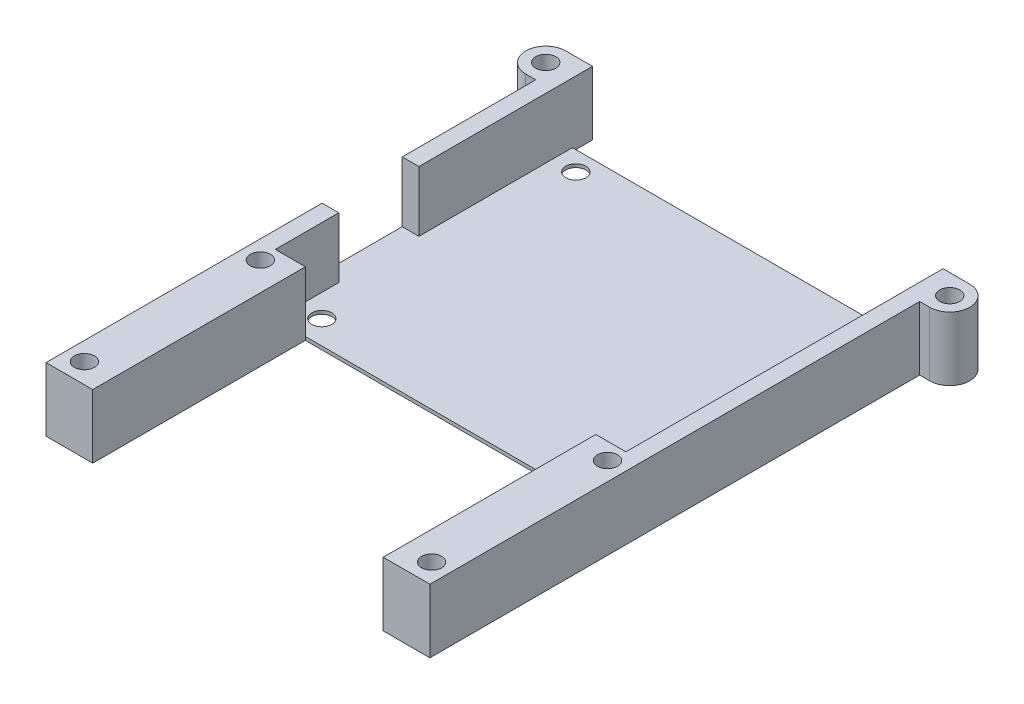
ISO-10303-21;
HEADER;
FILE_DESCRIPTION(('STEP AP214'),'2;1');
FILE_NAME('part.step','',(''),(''),'','','');
FILE_SCHEMA(('AUTOMOTIVE_DESIGN { 1 0 10303 214 1 1 1 1 }'));
ENDSEC;
DATA;
#1=APPLICATION_CONTEXT('core data for automotive mechanical design processes');
#2=APPLICATION_PROTOCOL_DEFINITION('international standard','automotive_design',2000,#1);
#3=PRODUCT_CONTEXT('',#1,'mechanical');
#4=PRODUCT('Part','Part','',(#3));
#5=PRODUCT_RELATED_PRODUCT_CATEGORY('part','',(#4));
#6=PRODUCT_DEFINITION_FORMATION('','',#4);
#7=PRODUCT_DEFINITION_CONTEXT('part definition',#1,'design');
#8=PRODUCT_DEFINITION('design','',#6,#7);
#9=PRODUCT_DEFINITION_SHAPE('','',#8);
#10=(LENGTH_UNIT() NAMED_UNIT(*) SI_UNIT(.MILLI.,.METRE.));
#11=(NAMED_UNIT(*) PLANE_ANGLE_UNIT() SI_UNIT($,.RADIAN.));
#12=(NAMED_UNIT(*) SI_UNIT($,.STERADIAN.) SOLID_ANGLE_UNIT());
#13=UNCERTAINTY_MEASURE_WITH_UNIT(LENGTH_MEASURE(1.E-05),#10,'distance_accuracy_value','');
#14=(GEOMETRIC_REPRESENTATION_CONTEXT(3) GLOBAL_UNCERTAINTY_ASSIGNED_CONTEXT((#13)) GLOBAL_UNIT_ASSIGNED_CONTEXT((#10,
#11,#12)) REPRESENTATION_CONTEXT('',''));
#15=CARTESIAN_POINT('',(0.,0.,0.));
#16=DIRECTION('',(0.,0.,1.));
#17=DIRECTION('',(1.,0.,0.));
#18=AXIS2_PLACEMENT_3D('',#15,#16,#17);
#19=CARTESIAN_POINT('',(0.,0.5,-31.85));
#20=DIRECTION('',(0.,0.,1.));
#21=DIRECTION('',(1.,0.,0.));
#22=AXIS2_PLACEMENT_3D('',#19,#20,#21);
#23=PLANE('',#22);
#24=DIRECTION('',(0.,-1.,0.));
#25=VECTOR('',#24,1.);
#26=CARTESIAN_POINT('',(21.75,9.55,-31.85));
#27=LINE('',#26,#25);
#28=CARTESIAN_POINT('',(21.75,0.5,-31.85));
#29=VERTEX_POINT('',#28);
#30=CARTESIAN_POINT('',(21.75,0.,-31.85));
#31=VERTEX_POINT('',#30);
#32=EDGE_CURVE('E296',#29,#31,#27,.T.);
#33=ORIENTED_EDGE('',*,*,#32,.F.);
#34=DIRECTION('',(-1.,0.,0.));
#35=VECTOR('',#34,1.);
#36=CARTESIAN_POINT('',(0.,0.5,-31.85));
#37=LINE('',#36,#35);
#38=CARTESIAN_POINT('',(-21.75,0.5,-31.85));
#39=VERTEX_POINT('',#38);
#40=EDGE_CURVE('E64',#29,#39,#37,.T.);
#41=ORIENTED_EDGE('',*,*,#40,.T.);
#42=DIRECTION('',(0.,-1.,0.));
#43=VECTOR('',#42,1.);
#44=CARTESIAN_POINT('',(-21.75,9.55,-31.85));
#45=LINE('',#44,#43);
#46=CARTESIAN_POINT('',(-21.75,0.,-31.85));
#47=VERTEX_POINT('',#46);
#48=EDGE_CURVE('E341',#39,#47,#45,.T.);
#49=ORIENTED_EDGE('',*,*,#48,.T.);
#50=DIRECTION('',(-1.,0.,0.));
#51=VECTOR('',#50,1.);
#52=CARTESIAN_POINT('',(0.,0.,-31.85));
#53=LINE('',#52,#51);
#54=EDGE_CURVE('E356',#31,#47,#53,.T.);
#55=ORIENTED_EDGE('',*,*,#54,.F.);
#56=EDGE_LOOP('',(#33,#41,#49,#55));
#57=FACE_BOUND('',#56,.T.);
#58=ADVANCED_FACE('F40',(#57),#23,.T.);
#59=CARTESIAN_POINT('',(0.,0.5,-76.35));
#60=DIRECTION('',(0.,0.,-1.));
#61=DIRECTION('',(-1.,0.,0.));
#62=AXIS2_PLACEMENT_3D('',#59,#60,#61);
#63=PLANE('',#62);
#64=DIRECTION('',(1.,0.,0.));
#65=VECTOR('',#64,1.);
#66=CARTESIAN_POINT('',(0.,0.,-76.35));
#67=LINE('',#66,#65);
#68=CARTESIAN_POINT('',(-26.25,0.,-76.35));
#69=VERTEX_POINT('',#68);
#70=CARTESIAN_POINT('',(26.25,0.,-76.35));
#71=VERTEX_POINT('',#70);
#72=EDGE_CURVE('E376',#69,#71,#67,.T.);
#73=ORIENTED_EDGE('',*,*,#72,.F.);
#74=DIRECTION('',(0.,-1.,0.));
#75=VECTOR('',#74,1.);
#76=CARTESIAN_POINT('',(-26.25,0.5,-76.35));
#77=LINE('',#76,#75);
#78=CARTESIAN_POINT('',(-26.25,0.5,-76.35));
#79=VERTEX_POINT('',#78);
#80=EDGE_CURVE('E48',#79,#69,#77,.T.);
#81=ORIENTED_EDGE('',*,*,#80,.F.);
#82=DIRECTION('',(1.,0.,0.));
#83=VECTOR('',#82,1.);
#84=CARTESIAN_POINT('',(0.,0.5,-76.35));
#85=LINE('',#84,#83);
#86=CARTESIAN_POINT('',(26.25,0.5,-76.35));
#87=VERTEX_POINT('',#86);
#88=EDGE_CURVE('E361',#79,#87,#85,.T.);
#89=ORIENTED_EDGE('',*,*,#88,.T.);
#90=DIRECTION('',(0.,-1.,0.));
#91=VECTOR('',#90,1.);
#92=CARTESIAN_POINT('',(26.25,0.5,-76.35));
#93=LINE('',#92,#91);
#94=EDGE_CURVE('E11',#87,#71,#93,.T.);
#95=ORIENTED_EDGE('',*,*,#94,.T.);
#96=EDGE_LOOP('',(#73,#81,#89,#95));
#97=FACE_BOUND('',#96,.T.);
#98=ADVANCED_FACE('F471',(#97),#63,.T.);
#99=CARTESIAN_POINT('',(-28.75,0.5,0.));
#100=DIRECTION('',(-1.,0.,0.));
#101=DIRECTION('',(0.,0.,1.));
#102=AXIS2_PLACEMENT_3D('',#99,#100,#101);
#103=PLANE('',#102);
#104=DIRECTION('',(0.,0.,-1.));
#105=VECTOR('',#104,1.);
#106=CARTESIAN_POINT('',(-28.75,0.,0.));
#107=LINE('',#106,#105);
#108=CARTESIAN_POINT('',(-28.75,0.,0.));
#109=VERTEX_POINT('',#108);
#110=CARTESIAN_POINT('',(-28.75,0.,-73.35));
#111=VERTEX_POINT('',#110);
#112=EDGE_CURVE('E379',#109,#111,#107,.T.);
#113=ORIENTED_EDGE('',*,*,#112,.F.);
#114=DIRECTION('',(0.,-1.,0.));
#115=VECTOR('',#114,1.);
#116=CARTESIAN_POINT('',(-28.75,9.55,0.));
#117=LINE('',#116,#115);
#118=CARTESIAN_POINT('',(-28.75,9.55,0.));
#119=VERTEX_POINT('',#118);
#120=EDGE_CURVE('E347',#119,#109,#117,.T.);
#121=ORIENTED_EDGE('',*,*,#120,.F.);
#122=DIRECTION('',(0.,0.,-1.));
#123=VECTOR('',#122,1.);
#124=CARTESIAN_POINT('',(-28.75,9.55,0.));
#125=LINE('',#124,#123);
#126=CARTESIAN_POINT('',(-28.75,9.55,-41.35));
#127=VERTEX_POINT('',#126);
#128=EDGE_CURVE('E315',#119,#127,#125,.T.);
#129=ORIENTED_EDGE('',*,*,#128,.T.);
#130=DIRECTION('',(0.,-1.,0.));
#131=VECTOR('',#130,1.);
#132=CARTESIAN_POINT('',(-28.75,9.55,-41.35));
#133=LINE('',#132,#131);
#134=CARTESIAN_POINT('',(-28.75,0.5,-41.35));
#135=VERTEX_POINT('',#134);
#136=EDGE_CURVE('E350',#127,#135,#133,.T.);
#137=ORIENTED_EDGE('',*,*,#136,.T.);
#138=DIRECTION('',(0.,0.,-1.));
#139=VECTOR('',#138,1.);
#140=CARTESIAN_POINT('',(-28.75,0.5,0.));
#141=LINE('',#140,#139);
#142=CARTESIAN_POINT('',(-28.75,0.5,-53.35));
#143=VERTEX_POINT('',#142);
#144=EDGE_CURVE('E370',#135,#143,#141,.T.);
#145=ORIENTED_EDGE('',*,*,#144,.T.);
#146=DIRECTION('',(0.,-1.,0.));
#147=VECTOR('',#146,1.);
#148=CARTESIAN_POINT('',(-28.75,9.55,-53.35));
#149=LINE('',#148,#147);
#150=CARTESIAN_POINT('',(-28.75,9.55,-53.35));
#151=VERTEX_POINT('',#150);
#152=EDGE_CURVE('E248',#151,#143,#149,.T.);
#153=ORIENTED_EDGE('',*,*,#152,.F.);
#154=DIRECTION('',(0.,0.,-1.));
#155=VECTOR('',#154,1.);
#156=CARTESIAN_POINT('',(-28.75,9.55,0.));
#157=LINE('',#156,#155);
#158=CARTESIAN_POINT('',(-28.75,9.55,-73.35));
#159=VERTEX_POINT('',#158);
#160=EDGE_CURVE('E225',#151,#159,#157,.T.);
#161=ORIENTED_EDGE('',*,*,#160,.T.);
#162=DIRECTION('',(0.,-1.,0.));
#163=VECTOR('',#162,1.);
#164=CARTESIAN_POINT('',(-28.75,9.55,-73.35));
#165=LINE('',#164,#163);
#166=EDGE_CURVE('E251',#159,#111,#165,.T.);
#167=ORIENTED_EDGE('',*,*,#166,.T.);
#168=EDGE_LOOP('',(#113,#121,#129,#137,#145,#153,#161,#167));
#169=FACE_BOUND('',#168,.T.);
#170=ADVANCED_FACE('F485',(#169),#103,.T.);
#171=CARTESIAN_POINT('',(0.,0.5,0.));
#172=DIRECTION('',(0.,1.,0.));
#173=DIRECTION('',(0.,0.,1.));
#174=AXIS2_PLACEMENT_3D('',#171,#172,#173);
#175=PLANE('',#174);
#176=CARTESIAN_POINT('',(22.85,0.5,-73.45));
#177=DIRECTION('',(0.,1.,0.));
#178=DIRECTION('',(0.,0.,1.));
#179=AXIS2_PLACEMENT_3D('',#176,#177,#178);
#180=CIRCLE('',#179,1.5);
#181=CARTESIAN_POINT('',(22.85,0.5,-71.95));
#182=VERTEX_POINT('',#181);
#183=EDGE_CURVE('E436',#182,#182,#180,.T.);
#184=ORIENTED_EDGE('',*,*,#183,.F.);
#185=EDGE_LOOP('',(#184));
#186=FACE_BOUND('',#185,.T.);
#187=CARTESIAN_POINT('',(-22.85,0.5,-73.45));
#188=DIRECTION('',(0.,1.,0.));
#189=DIRECTION('',(0.,0.,1.));
#190=AXIS2_PLACEMENT_3D('',#187,#188,#189);
#191=CIRCLE('',#190,1.5);
#192=CARTESIAN_POINT('',(-22.85,0.5,-71.95));
#193=VERTEX_POINT('',#192);
#194=EDGE_CURVE('E430',#193,#193,#191,.T.);
#195=ORIENTED_EDGE('',*,*,#194,.F.);
#196=EDGE_LOOP('',(#195));
#197=FACE_BOUND('',#196,.T.);
#198=CARTESIAN_POINT('',(-22.85,0.5,-35.4));
#199=DIRECTION('',(0.,1.,0.));
#200=DIRECTION('',(0.,0.,1.));
#201=AXIS2_PLACEMENT_3D('',#198,#199,#200);
#202=CIRCLE('',#201,1.5);
#203=CARTESIAN_POINT('',(-22.85,0.5,-33.9));
#204=VERTEX_POINT('',#203);
#205=EDGE_CURVE('E418',#204,#204,#202,.T.);
#206=ORIENTED_EDGE('',*,*,#205,.F.);
#207=EDGE_LOOP('',(#206));
#208=FACE_BOUND('',#207,.T.);
#209=CARTESIAN_POINT('',(22.85,0.5,-35.4));
#210=DIRECTION('',(0.,1.,0.));
#211=DIRECTION('',(0.,0.,1.));
#212=AXIS2_PLACEMENT_3D('',#209,#210,#211);
#213=CIRCLE('',#212,1.5);
#214=CARTESIAN_POINT('',(22.85,0.5,-33.9));
#215=VERTEX_POINT('',#214);
#216=EDGE_CURVE('E412',#215,#215,#213,.T.);
#217=ORIENTED_EDGE('',*,*,#216,.F.);
#218=EDGE_LOOP('',(#217));
#219=FACE_BOUND('',#218,.T.);
#220=CARTESIAN_POINT('',(26.25,0.5,-31.85));
#221=VERTEX_POINT('',#220);
#222=EDGE_CURVE('E357',#221,#29,#37,.T.);
#223=ORIENTED_EDGE('',*,*,#222,.F.);
#224=DIRECTION('',(0.,0.,1.));
#225=VECTOR('',#224,1.);
#226=CARTESIAN_POINT('',(26.25,0.5,0.));
#227=LINE('',#226,#225);
#228=EDGE_CURVE('E359',#87,#221,#227,.T.);
#229=ORIENTED_EDGE('',*,*,#228,.F.);
#230=ORIENTED_EDGE('',*,*,#88,.F.);
#231=DIRECTION('',(0.,0.,1.));
#232=VECTOR('',#231,1.);
#233=CARTESIAN_POINT('',(-26.25,0.5,0.));
#234=LINE('',#233,#232);
#235=CARTESIAN_POINT('',(-26.25,0.5,-53.35));
#236=VERTEX_POINT('',#235);
#237=EDGE_CURVE('E364',#79,#236,#234,.T.);
#238=ORIENTED_EDGE('',*,*,#237,.T.);
#239=DIRECTION('',(1.,0.,0.));
#240=VECTOR('',#239,1.);
#241=CARTESIAN_POINT('',(0.,0.5,-53.35));
#242=LINE('',#241,#240);
#243=EDGE_CURVE('E366',#143,#236,#242,.T.);
#244=ORIENTED_EDGE('',*,*,#243,.F.);
#245=ORIENTED_EDGE('',*,*,#144,.F.);
#246=DIRECTION('',(1.,0.,0.));
#247=VECTOR('',#246,1.);
#248=CARTESIAN_POINT('',(0.,0.5,-41.35));
#249=LINE('',#248,#247);
#250=CARTESIAN_POINT('',(-26.25,0.5,-41.35));
#251=VERTEX_POINT('',#250);
#252=EDGE_CURVE('E373',#135,#251,#249,.T.);
#253=ORIENTED_EDGE('',*,*,#252,.T.);
#254=CARTESIAN_POINT('',(-26.25,0.5,-31.85));
#255=VERTEX_POINT('',#254);
#256=EDGE_CURVE('E367',#251,#255,#234,.T.);
#257=ORIENTED_EDGE('',*,*,#256,.T.);
#258=DIRECTION('',(-1.,0.,0.));
#259=VECTOR('',#258,1.);
#260=CARTESIAN_POINT('',(0.,0.5,-31.85));
#261=LINE('',#260,#259);
#262=EDGE_CURVE('E353',#39,#255,#261,.T.);
#263=ORIENTED_EDGE('',*,*,#262,.F.);
#264=ORIENTED_EDGE('',*,*,#40,.F.);
#265=EDGE_LOOP('',(#223,#229,#230,#238,#244,#245,#253,#257,#263,#264));
#266=FACE_BOUND('',#265,.T.);
#267=ADVANCED_FACE('F449',(#186,#197,#208,#219,#266),#175,.T.);
#268=CARTESIAN_POINT('',(0.,0.,0.));
#269=DIRECTION('',(0.,1.,0.));
#270=DIRECTION('',(0.,0.,1.));
#271=AXIS2_PLACEMENT_3D('',#268,#269,#270);
#272=PLANE('',#271);
#273=CARTESIAN_POINT('',(22.85,0.,-73.45));
#274=DIRECTION('',(0.,-1.,0.));
#275=DIRECTION('',(0.,0.,-1.));
#276=AXIS2_PLACEMENT_3D('',#273,#274,#275);
#277=CIRCLE('',#276,1.5);
#278=CARTESIAN_POINT('',(22.85,0.,-74.95));
#279=VERTEX_POINT('',#278);
#280=EDGE_CURVE('E439',#279,#279,#277,.T.);
#281=ORIENTED_EDGE('',*,*,#280,.F.);
#282=EDGE_LOOP('',(#281));
#283=FACE_BOUND('',#282,.T.);
#284=CARTESIAN_POINT('',(-22.85,0.,-73.45));
#285=DIRECTION('',(0.,-1.,0.));
#286=DIRECTION('',(0.,0.,-1.));
#287=AXIS2_PLACEMENT_3D('',#284,#285,#286);
#288=CIRCLE('',#287,1.5);
#289=CARTESIAN_POINT('',(-22.85,0.,-74.95));
#290=VERTEX_POINT('',#289);
#291=EDGE_CURVE('E433',#290,#290,#288,.T.);
#292=ORIENTED_EDGE('',*,*,#291,.F.);
#293=EDGE_LOOP('',(#292));
#294=FACE_BOUND('',#293,.T.);
#295=CARTESIAN_POINT('',(-26.,0.,-29.35));
#296=DIRECTION('',(0.,-1.,0.));
#297=DIRECTION('',(0.,0.,-1.));
#298=AXIS2_PLACEMENT_3D('',#295,#296,#297);
#299=CIRCLE('',#298,1.5);
#300=CARTESIAN_POINT('',(-26.,0.,-30.85));
#301=VERTEX_POINT('',#300);
#302=EDGE_CURVE('E427',#301,#301,#299,.T.);
#303=ORIENTED_EDGE('',*,*,#302,.F.);
#304=EDGE_LOOP('',(#303));
#305=FACE_BOUND('',#304,.T.);
#306=CARTESIAN_POINT('',(-22.85,0.,-35.4));
#307=DIRECTION('',(0.,-1.,0.));
#308=DIRECTION('',(0.,0.,-1.));
#309=AXIS2_PLACEMENT_3D('',#306,#307,#308);
#310=CIRCLE('',#309,1.5);
#311=CARTESIAN_POINT('',(-22.85,0.,-36.9));
#312=VERTEX_POINT('',#311);
#313=EDGE_CURVE('E421',#312,#312,#310,.T.);
#314=ORIENTED_EDGE('',*,*,#313,.F.);
#315=EDGE_LOOP('',(#314));
#316=FACE_BOUND('',#315,.T.);
#317=CARTESIAN_POINT('',(22.85,0.,-35.4));
#318=DIRECTION('',(0.,-1.,0.));
#319=DIRECTION('',(0.,0.,-1.));
#320=AXIS2_PLACEMENT_3D('',#317,#318,#319);
#321=CIRCLE('',#320,1.5);
#322=CARTESIAN_POINT('',(22.85,0.,-36.9));
#323=VERTEX_POINT('',#322);
#324=EDGE_CURVE('E415',#323,#323,#321,.T.);
#325=ORIENTED_EDGE('',*,*,#324,.F.);
#326=EDGE_LOOP('',(#325));
#327=FACE_BOUND('',#326,.T.);
#328=CARTESIAN_POINT('',(26.,0.,-29.35));
#329=DIRECTION('',(0.,-1.,0.));
#330=DIRECTION('',(0.,0.,-1.));
#331=AXIS2_PLACEMENT_3D('',#328,#329,#330);
#332=CIRCLE('',#331,1.5);
#333=CARTESIAN_POINT('',(26.,0.,-30.85));
#334=VERTEX_POINT('',#333);
#335=EDGE_CURVE('E409',#334,#334,#332,.T.);
#336=ORIENTED_EDGE('',*,*,#335,.F.);
#337=EDGE_LOOP('',(#336));
#338=FACE_BOUND('',#337,.T.);
#339=CARTESIAN_POINT('',(26.,0.,-3.));
#340=DIRECTION('',(0.,-1.,0.));
#341=DIRECTION('',(0.,0.,-1.));
#342=AXIS2_PLACEMENT_3D('',#339,#340,#341);
#343=CIRCLE('',#342,1.5);
#344=CARTESIAN_POINT('',(26.,0.,-4.5));
#345=VERTEX_POINT('',#344);
#346=EDGE_CURVE('E403',#345,#345,#343,.T.);
#347=ORIENTED_EDGE('',*,*,#346,.F.);
#348=EDGE_LOOP('',(#347));
#349=FACE_BOUND('',#348,.T.);
#350=CARTESIAN_POINT('',(-26.,0.,-3.));
#351=DIRECTION('',(0.,-1.,0.));
#352=DIRECTION('',(0.,0.,-1.));
#353=AXIS2_PLACEMENT_3D('',#350,#351,#352);
#354=CIRCLE('',#353,1.5);
#355=CARTESIAN_POINT('',(-26.,0.,-4.5));
#356=VERTEX_POINT('',#355);
#357=EDGE_CURVE('E396',#356,#356,#354,.T.);
#358=ORIENTED_EDGE('',*,*,#357,.F.);
#359=EDGE_LOOP('',(#358));
#360=FACE_BOUND('',#359,.T.);
#361=CARTESIAN_POINT('',(30.25,0.,-76.35));
#362=DIRECTION('',(0.,-1.,0.));
#363=DIRECTION('',(0.,0.,-1.));
#364=AXIS2_PLACEMENT_3D('',#361,#362,#363);
#365=CIRCLE('',#364,1.5);
#366=CARTESIAN_POINT('',(30.25,0.,-77.85));
#367=VERTEX_POINT('',#366);
#368=EDGE_CURVE('E387',#367,#367,#365,.T.);
#369=ORIENTED_EDGE('',*,*,#368,.F.);
#370=EDGE_LOOP('',(#369));
#371=FACE_BOUND('',#370,.T.);
#372=CARTESIAN_POINT('',(-30.25,0.,-76.35));
#373=DIRECTION('',(0.,-1.,0.));
#374=DIRECTION('',(0.,0.,-1.));
#375=AXIS2_PLACEMENT_3D('',#372,#373,#374);
#376=CIRCLE('',#375,1.5);
#377=CARTESIAN_POINT('',(-30.25,0.,-77.85));
#378=VERTEX_POINT('',#377);
#379=EDGE_CURVE('E384',#378,#378,#376,.T.);
#380=ORIENTED_EDGE('',*,*,#379,.F.);
#381=EDGE_LOOP('',(#380));
#382=FACE_BOUND('',#381,.T.);
#383=ORIENTED_EDGE('',*,*,#72,.T.);
#384=DIRECTION('',(0.,0.,1.));
#385=VECTOR('',#384,1.);
#386=CARTESIAN_POINT('',(26.25,0.,0.));
#387=LINE('',#386,#385);
#388=CARTESIAN_POINT('',(26.25,0.,-79.35));
#389=VERTEX_POINT('',#388);
#390=EDGE_CURVE('E289',#389,#71,#387,.T.);
#391=ORIENTED_EDGE('',*,*,#390,.F.);
#392=DIRECTION('',(1.,0.,0.));
#393=VECTOR('',#392,1.);
#394=CARTESIAN_POINT('',(0.,0.,-79.35));
#395=LINE('',#394,#393);
#396=CARTESIAN_POINT('',(30.25,0.,-79.35));
#397=VERTEX_POINT('',#396);
#398=EDGE_CURVE('E286',#389,#397,#395,.T.);
#399=ORIENTED_EDGE('',*,*,#398,.T.);
#400=CARTESIAN_POINT('',(30.25,0.,-76.35));
#401=DIRECTION('',(0.,1.,0.));
#402=DIRECTION('',(0.,0.,1.));
#403=AXIS2_PLACEMENT_3D('',#400,#401,#402);
#404=CIRCLE('',#403,3.00000000000001);
#405=CARTESIAN_POINT('',(30.25,0.,-73.35));
#406=VERTEX_POINT('',#405);
#407=EDGE_CURVE('E283',#406,#397,#404,.T.);
#408=ORIENTED_EDGE('',*,*,#407,.F.);
#409=DIRECTION('',(-1.,0.,0.));
#410=VECTOR('',#409,1.);
#411=CARTESIAN_POINT('',(0.,0.,-73.35));
#412=LINE('',#411,#410);
#413=CARTESIAN_POINT('',(28.75,0.,-73.35));
#414=VERTEX_POINT('',#413);
#415=EDGE_CURVE('E280',#406,#414,#412,.T.);
#416=ORIENTED_EDGE('',*,*,#415,.T.);
#417=DIRECTION('',(0.,0.,1.));
#418=VECTOR('',#417,1.);
#419=CARTESIAN_POINT('',(28.75,0.,0.));
#420=LINE('',#419,#418);
#421=CARTESIAN_POINT('',(28.75,0.,0.));
#422=VERTEX_POINT('',#421);
#423=EDGE_CURVE('E210',#414,#422,#420,.T.);
#424=ORIENTED_EDGE('',*,*,#423,.T.);
#425=DIRECTION('',(-1.,0.,0.));
#426=VECTOR('',#425,1.);
#427=CARTESIAN_POINT('',(0.,0.,0.));
#428=LINE('',#427,#426);
#429=CARTESIAN_POINT('',(21.75,0.,0.));
#430=VERTEX_POINT('',#429);
#431=EDGE_CURVE('E259',#422,#430,#428,.T.);
#432=ORIENTED_EDGE('',*,*,#431,.T.);
#433=DIRECTION('',(0.,0.,-1.));
#434=VECTOR('',#433,1.);
#435=CARTESIAN_POINT('',(21.75,0.,0.));
#436=LINE('',#435,#434);
#437=EDGE_CURVE('E56',#430,#31,#436,.T.);
#438=ORIENTED_EDGE('',*,*,#437,.T.);
#439=ORIENTED_EDGE('',*,*,#54,.T.);
#440=DIRECTION('',(0.,0.,1.));
#441=VECTOR('',#440,1.);
#442=CARTESIAN_POINT('',(-21.75,0.,0.));
#443=LINE('',#442,#441);
#444=CARTESIAN_POINT('',(-21.75,0.,0.));
#445=VERTEX_POINT('',#444);
#446=EDGE_CURVE('E316',#47,#445,#443,.T.);
#447=ORIENTED_EDGE('',*,*,#446,.T.);
#448=DIRECTION('',(-1.,0.,0.));
#449=VECTOR('',#448,1.);
#450=CARTESIAN_POINT('',(0.,0.,0.));
#451=LINE('',#450,#449);
#452=EDGE_CURVE('E311',#445,#109,#451,.T.);
#453=ORIENTED_EDGE('',*,*,#452,.T.);
#454=ORIENTED_EDGE('',*,*,#112,.T.);
#455=DIRECTION('',(1.,0.,0.));
#456=VECTOR('',#455,1.);
#457=CARTESIAN_POINT('',(0.,0.,-73.35));
#458=LINE('',#457,#456);
#459=CARTESIAN_POINT('',(-30.25,0.,-73.35));
#460=VERTEX_POINT('',#459);
#461=EDGE_CURVE('E239',#460,#111,#458,.T.);
#462=ORIENTED_EDGE('',*,*,#461,.F.);
#463=CARTESIAN_POINT('',(-30.25,0.,-76.35));
#464=DIRECTION('',(0.,1.,0.));
#465=DIRECTION('',(0.,0.,1.));
#466=AXIS2_PLACEMENT_3D('',#463,#464,#465);
#467=CIRCLE('',#466,3.00000000000001);
#468=CARTESIAN_POINT('',(-30.25,0.,-79.35));
#469=VERTEX_POINT('',#468);
#470=EDGE_CURVE('E236',#460,#469,#467,.F.);
#471=ORIENTED_EDGE('',*,*,#470,.T.);
#472=DIRECTION('',(1.,0.,0.));
#473=VECTOR('',#472,1.);
#474=CARTESIAN_POINT('',(0.,0.,-79.35));
#475=LINE('',#474,#473);
#476=CARTESIAN_POINT('',(-26.25,0.,-79.35));
#477=VERTEX_POINT('',#476);
#478=EDGE_CURVE('E205',#469,#477,#475,.T.);
#479=ORIENTED_EDGE('',*,*,#478,.T.);
#480=DIRECTION('',(0.,0.,1.));
#481=VECTOR('',#480,1.);
#482=CARTESIAN_POINT('',(-26.25,0.,0.));
#483=LINE('',#482,#481);
#484=EDGE_CURVE('E219',#477,#69,#483,.T.);
#485=ORIENTED_EDGE('',*,*,#484,.T.);
#486=EDGE_LOOP('',(#383,#391,#399,#408,#416,#424,#432,#438,#439,#447,#453,#454,#462,#471,#479,#485));
#487=FACE_BOUND('',#486,.T.);
#488=ADVANCED_FACE('F445',(#283,#294,#305,#316,#327,#338,#349,#360,#371,#382,#487),#272,.F.);
#489=CARTESIAN_POINT('',(0.,9.55,-41.35));
#490=DIRECTION('',(0.,0.,-1.));
#491=DIRECTION('',(-1.,0.,0.));
#492=AXIS2_PLACEMENT_3D('',#489,#490,#491);
#493=PLANE('',#492);
#494=DIRECTION('',(0.,-1.,0.));
#495=VECTOR('',#494,1.);
#496=CARTESIAN_POINT('',(-26.25,9.55,-41.35));
#497=LINE('',#496,#495);
#498=CARTESIAN_POINT('',(-26.25,9.55,-41.35));
#499=VERTEX_POINT('',#498);
#500=EDGE_CURVE('E331',#499,#251,#497,.T.);
#501=ORIENTED_EDGE('',*,*,#500,.T.);
#502=ORIENTED_EDGE('',*,*,#252,.F.);
#503=ORIENTED_EDGE('',*,*,#136,.F.);
#504=DIRECTION('',(1.,0.,0.));
#505=VECTOR('',#504,1.);
#506=CARTESIAN_POINT('',(0.,9.55,-41.35));
#507=LINE('',#506,#505);
#508=EDGE_CURVE('E312',#127,#499,#507,.T.);
#509=ORIENTED_EDGE('',*,*,#508,.T.);
#510=EDGE_LOOP('',(#501,#502,#503,#509));
#511=FACE_BOUND('',#510,.T.);
#512=ADVANCED_FACE('F448',(#511),#493,.T.);
#513=CARTESIAN_POINT('',(0.,9.55,0.));
#514=DIRECTION('',(0.,0.,1.));
#515=DIRECTION('',(1.,0.,0.));
#516=AXIS2_PLACEMENT_3D('',#513,#514,#515);
#517=PLANE('',#516);
#518=ORIENTED_EDGE('',*,*,#452,.F.);
#519=DIRECTION('',(0.,-1.,0.));
#520=VECTOR('',#519,1.);
#521=CARTESIAN_POINT('',(-21.75,9.55,0.));
#522=LINE('',#521,#520);
#523=CARTESIAN_POINT('',(-21.75,9.55,0.));
#524=VERTEX_POINT('',#523);
#525=EDGE_CURVE('E345',#524,#445,#522,.T.);
#526=ORIENTED_EDGE('',*,*,#525,.F.);
#527=DIRECTION('',(-1.,0.,0.));
#528=VECTOR('',#527,1.);
#529=CARTESIAN_POINT('',(0.,9.55,0.));
#530=LINE('',#529,#528);
#531=EDGE_CURVE('E319',#524,#119,#530,.T.);
#532=ORIENTED_EDGE('',*,*,#531,.T.);
#533=ORIENTED_EDGE('',*,*,#120,.T.);
#534=EDGE_LOOP('',(#518,#526,#532,#533));
#535=FACE_BOUND('',#534,.T.);
#536=ADVANCED_FACE('F507',(#535),#517,.T.);
#537=CARTESIAN_POINT('',(-21.75,9.55,0.));
#538=DIRECTION('',(1.,0.,0.));
#539=DIRECTION('',(0.,0.,-1.));
#540=AXIS2_PLACEMENT_3D('',#537,#538,#539);
#541=PLANE('',#540);
#542=ORIENTED_EDGE('',*,*,#446,.F.);
#543=ORIENTED_EDGE('',*,*,#48,.F.);
#544=CARTESIAN_POINT('',(-21.75,9.55,-31.85));
#545=VERTEX_POINT('',#544);
#546=EDGE_CURVE('E342',#545,#39,#45,.T.);
#547=ORIENTED_EDGE('',*,*,#546,.F.);
#548=DIRECTION('',(0.,0.,1.));
#549=VECTOR('',#548,1.);
#550=CARTESIAN_POINT('',(-21.75,9.55,0.));
#551=LINE('',#550,#549);
#552=EDGE_CURVE('E322',#545,#524,#551,.T.);
#553=ORIENTED_EDGE('',*,*,#552,.T.);
#554=ORIENTED_EDGE('',*,*,#525,.T.);
#555=EDGE_LOOP('',(#542,#543,#547,#553,#554));
#556=FACE_BOUND('',#555,.T.);
#557=ADVANCED_FACE('F500',(#556),#541,.T.);
#558=CARTESIAN_POINT('',(0.,9.55,-31.85));
#559=DIRECTION('',(0.,0.,-1.));
#560=DIRECTION('',(-1.,0.,0.));
#561=AXIS2_PLACEMENT_3D('',#558,#559,#560);
#562=PLANE('',#561);
#563=ORIENTED_EDGE('',*,*,#546,.T.);
#564=ORIENTED_EDGE('',*,*,#262,.T.);
#565=DIRECTION('',(0.,-1.,0.));
#566=VECTOR('',#565,1.);
#567=CARTESIAN_POINT('',(-26.25,9.55,-31.85));
#568=LINE('',#567,#566);
#569=CARTESIAN_POINT('',(-26.25,9.55,-31.85));
#570=VERTEX_POINT('',#569);
#571=EDGE_CURVE('E338',#570,#255,#568,.T.);
#572=ORIENTED_EDGE('',*,*,#571,.F.);
#573=DIRECTION('',(1.,0.,0.));
#574=VECTOR('',#573,1.);
#575=CARTESIAN_POINT('',(0.,9.55,-31.85));
#576=LINE('',#575,#574);
#577=EDGE_CURVE('E325',#570,#545,#576,.T.);
#578=ORIENTED_EDGE('',*,*,#577,.T.);
#579=EDGE_LOOP('',(#563,#564,#572,#578));
#580=FACE_BOUND('',#579,.T.);
#581=ADVANCED_FACE('F495',(#580),#562,.T.);
#582=CARTESIAN_POINT('',(-26.25,9.55,0.));
#583=DIRECTION('',(1.,0.,0.));
#584=DIRECTION('',(0.,0.,-1.));
#585=AXIS2_PLACEMENT_3D('',#582,#583,#584);
#586=PLANE('',#585);
#587=ORIENTED_EDGE('',*,*,#571,.T.);
#588=ORIENTED_EDGE('',*,*,#256,.F.);
#589=ORIENTED_EDGE('',*,*,#500,.F.);
#590=DIRECTION('',(0.,0.,1.));
#591=VECTOR('',#590,1.);
#592=CARTESIAN_POINT('',(-26.25,9.55,0.));
#593=LINE('',#592,#591);
#594=EDGE_CURVE('E328',#499,#570,#593,.T.);
#595=ORIENTED_EDGE('',*,*,#594,.T.);
#596=EDGE_LOOP('',(#587,#588,#589,#595));
#597=FACE_BOUND('',#596,.T.);
#598=ADVANCED_FACE('F492',(#597),#586,.T.);
#599=CARTESIAN_POINT('',(0.,9.55,0.));
#600=DIRECTION('',(0.,1.,0.));
#601=DIRECTION('',(0.,0.,1.));
#602=AXIS2_PLACEMENT_3D('',#599,#600,#601);
#603=PLANE('',#602);
#604=CARTESIAN_POINT('',(-26.,9.55,-29.35));
#605=DIRECTION('',(0.,1.,0.));
#606=DIRECTION('',(0.,0.,1.));
#607=AXIS2_PLACEMENT_3D('',#604,#605,#606);
#608=CIRCLE('',#607,1.5);
#609=CARTESIAN_POINT('',(-26.,9.55,-27.85));
#610=VERTEX_POINT('',#609);
#611=EDGE_CURVE('E424',#610,#610,#608,.T.);
#612=ORIENTED_EDGE('',*,*,#611,.F.);
#613=EDGE_LOOP('',(#612));
#614=FACE_BOUND('',#613,.T.);
#615=CARTESIAN_POINT('',(-26.,9.55,-3.));
#616=DIRECTION('',(0.,1.,0.));
#617=DIRECTION('',(0.,0.,1.));
#618=AXIS2_PLACEMENT_3D('',#615,#616,#617);
#619=CIRCLE('',#618,1.5);
#620=CARTESIAN_POINT('',(-26.,9.55,-1.5));
#621=VERTEX_POINT('',#620);
#622=EDGE_CURVE('E43',#621,#621,#619,.T.);
#623=ORIENTED_EDGE('',*,*,#622,.F.);
#624=EDGE_LOOP('',(#623));
#625=FACE_BOUND('',#624,.T.);
#626=ORIENTED_EDGE('',*,*,#508,.F.);
#627=ORIENTED_EDGE('',*,*,#128,.F.);
#628=ORIENTED_EDGE('',*,*,#531,.F.);
#629=ORIENTED_EDGE('',*,*,#552,.F.);
#630=ORIENTED_EDGE('',*,*,#577,.F.);
#631=ORIENTED_EDGE('',*,*,#594,.F.);
#632=EDGE_LOOP('',(#626,#627,#628,#629,#630,#631));
#633=FACE_BOUND('',#632,.T.);
#634=ADVANCED_FACE('F503',(#614,#625,#633),#603,.T.);
#635=CARTESIAN_POINT('',(28.75,9.55,0.));
#636=DIRECTION('',(1.,0.,0.));
#637=DIRECTION('',(0.,0.,-1.));
#638=AXIS2_PLACEMENT_3D('',#635,#636,#637);
#639=PLANE('',#638);
#640=ORIENTED_EDGE('',*,*,#423,.F.);
#641=DIRECTION('',(0.,-1.,0.));
#642=VECTOR('',#641,1.);
#643=CARTESIAN_POINT('',(28.75,9.55,-73.35));
#644=LINE('',#643,#642);
#645=CARTESIAN_POINT('',(28.75,9.55,-73.35));
#646=VERTEX_POINT('',#645);
#647=EDGE_CURVE('E309',#646,#414,#644,.T.);
#648=ORIENTED_EDGE('',*,*,#647,.F.);
#649=DIRECTION('',(0.,0.,1.));
#650=VECTOR('',#649,1.);
#651=CARTESIAN_POINT('',(28.75,9.55,0.));
#652=LINE('',#651,#650);
#653=CARTESIAN_POINT('',(28.75,9.55,0.));
#654=VERTEX_POINT('',#653);
#655=EDGE_CURVE('E255',#646,#654,#652,.T.);
#656=ORIENTED_EDGE('',*,*,#655,.T.);
#657=DIRECTION('',(0.,-1.,0.));
#658=VECTOR('',#657,1.);
#659=CARTESIAN_POINT('',(28.75,9.55,0.));
#660=LINE('',#659,#658);
#661=EDGE_CURVE('E277',#654,#422,#660,.T.);
#662=ORIENTED_EDGE('',*,*,#661,.T.);
#663=EDGE_LOOP('',(#640,#648,#656,#662));
#664=FACE_BOUND('',#663,.T.);
#665=ADVANCED_FACE('F533',(#664),#639,.T.);
#666=CARTESIAN_POINT('',(0.,9.55,-73.35));
#667=DIRECTION('',(0.,0.,1.));
#668=DIRECTION('',(1.,0.,0.));
#669=AXIS2_PLACEMENT_3D('',#666,#667,#668);
#670=PLANE('',#669);
#671=ORIENTED_EDGE('',*,*,#415,.F.);
#672=DIRECTION('',(0.,-1.,0.));
#673=VECTOR('',#672,1.);
#674=CARTESIAN_POINT('',(30.25,9.55,-73.35));
#675=LINE('',#674,#673);
#676=CARTESIAN_POINT('',(30.25,9.55,-73.35));
#677=VERTEX_POINT('',#676);
#678=EDGE_CURVE('E307',#677,#406,#675,.T.);
#679=ORIENTED_EDGE('',*,*,#678,.F.);
#680=DIRECTION('',(-1.,0.,0.));
#681=VECTOR('',#680,1.);
#682=CARTESIAN_POINT('',(0.,9.55,-73.35));
#683=LINE('',#682,#681);
#684=EDGE_CURVE('E258',#677,#646,#683,.T.);
#685=ORIENTED_EDGE('',*,*,#684,.T.);
#686=ORIENTED_EDGE('',*,*,#647,.T.);
#687=EDGE_LOOP('',(#671,#679,#685,#686));
#688=FACE_BOUND('',#687,.T.);
#689=ADVANCED_FACE('F537',(#688),#670,.T.);
#690=CARTESIAN_POINT('',(30.25,9.55,-76.35));
#691=DIRECTION('',(0.,-1.,0.));
#692=DIRECTION('',(0.,0.,-1.));
#693=AXIS2_PLACEMENT_3D('',#690,#691,#692);
#694=CYLINDRICAL_SURFACE('',#693,3.00000000000001);
#695=ORIENTED_EDGE('',*,*,#407,.T.);
#696=DIRECTION('',(0.,-1.,0.));
#697=VECTOR('',#696,1.);
#698=CARTESIAN_POINT('',(30.25,9.55,-79.35));
#699=LINE('',#698,#697);
#700=CARTESIAN_POINT('',(30.25,9.55,-79.35));
#701=VERTEX_POINT('',#700);
#702=EDGE_CURVE('E305',#701,#397,#699,.T.);
#703=ORIENTED_EDGE('',*,*,#702,.F.);
#704=CARTESIAN_POINT('',(30.25,9.55,-76.35));
#705=DIRECTION('',(0.,1.,0.));
#706=DIRECTION('',(0.,0.,1.));
#707=AXIS2_PLACEMENT_3D('',#704,#705,#706);
#708=CIRCLE('',#707,3.00000000000001);
#709=EDGE_CURVE('E262',#677,#701,#708,.T.);
#710=ORIENTED_EDGE('',*,*,#709,.F.);
#711=ORIENTED_EDGE('',*,*,#678,.T.);
#712=EDGE_LOOP('',(#695,#703,#710,#711));
#713=FACE_BOUND('',#712,.T.);
#714=ADVANCED_FACE('F541',(#713),#694,.T.);
#715=CARTESIAN_POINT('',(0.,9.55,-79.35));
#716=DIRECTION('',(0.,0.,-1.));
#717=DIRECTION('',(-1.,0.,0.));
#718=AXIS2_PLACEMENT_3D('',#715,#716,#717);
#719=PLANE('',#718);
#720=ORIENTED_EDGE('',*,*,#398,.F.);
#721=DIRECTION('',(0.,-1.,0.));
#722=VECTOR('',#721,1.);
#723=CARTESIAN_POINT('',(26.25,9.55,-79.35));
#724=LINE('',#723,#722);
#725=CARTESIAN_POINT('',(26.25,9.55,-79.35));
#726=VERTEX_POINT('',#725);
#727=EDGE_CURVE('E303',#726,#389,#724,.T.);
#728=ORIENTED_EDGE('',*,*,#727,.F.);
#729=DIRECTION('',(1.,0.,0.));
#730=VECTOR('',#729,1.);
#731=CARTESIAN_POINT('',(0.,9.55,-79.35));
#732=LINE('',#731,#730);
#733=EDGE_CURVE('E264',#726,#701,#732,.T.);
#734=ORIENTED_EDGE('',*,*,#733,.T.);
#735=ORIENTED_EDGE('',*,*,#702,.T.);
#736=EDGE_LOOP('',(#720,#728,#734,#735));
#737=FACE_BOUND('',#736,.T.);
#738=ADVANCED_FACE('F545',(#737),#719,.T.);
#739=CARTESIAN_POINT('',(26.25,9.55,0.));
#740=DIRECTION('',(1.,0.,0.));
#741=DIRECTION('',(0.,0.,-1.));
#742=AXIS2_PLACEMENT_3D('',#739,#740,#741);
#743=PLANE('',#742);
#744=ORIENTED_EDGE('',*,*,#94,.F.);
#745=ORIENTED_EDGE('',*,*,#228,.T.);
#746=DIRECTION('',(0.,-1.,0.));
#747=VECTOR('',#746,1.);
#748=CARTESIAN_POINT('',(26.25,9.55,-31.85));
#749=LINE('',#748,#747);
#750=CARTESIAN_POINT('',(26.25,9.55,-31.85));
#751=VERTEX_POINT('',#750);
#752=EDGE_CURVE('E300',#751,#221,#749,.T.);
#753=ORIENTED_EDGE('',*,*,#752,.F.);
#754=DIRECTION('',(0.,0.,1.));
#755=VECTOR('',#754,1.);
#756=CARTESIAN_POINT('',(26.25,9.55,0.));
#757=LINE('',#756,#755);
#758=EDGE_CURVE('E267',#726,#751,#757,.T.);
#759=ORIENTED_EDGE('',*,*,#758,.F.);
#760=ORIENTED_EDGE('',*,*,#727,.T.);
#761=ORIENTED_EDGE('',*,*,#390,.T.);
#762=EDGE_LOOP('',(#744,#745,#753,#759,#760,#761));
#763=FACE_BOUND('',#762,.T.);
#764=ADVANCED_FACE('F549',(#763),#743,.F.);
#765=CARTESIAN_POINT('',(0.,9.55,-31.85));
#766=DIRECTION('',(0.,0.,1.));
#767=DIRECTION('',(1.,0.,0.));
#768=AXIS2_PLACEMENT_3D('',#765,#766,#767);
#769=PLANE('',#768);
#770=ORIENTED_EDGE('',*,*,#222,.T.);
#771=CARTESIAN_POINT('',(21.75,9.55,-31.85));
#772=VERTEX_POINT('',#771);
#773=EDGE_CURVE('E297',#772,#29,#27,.T.);
#774=ORIENTED_EDGE('',*,*,#773,.F.);
#775=DIRECTION('',(-1.,0.,0.));
#776=VECTOR('',#775,1.);
#777=CARTESIAN_POINT('',(0.,9.55,-31.85));
#778=LINE('',#777,#776);
#779=EDGE_CURVE('E269',#751,#772,#778,.T.);
#780=ORIENTED_EDGE('',*,*,#779,.F.);
#781=ORIENTED_EDGE('',*,*,#752,.T.);
#782=EDGE_LOOP('',(#770,#774,#780,#781));
#783=FACE_BOUND('',#782,.T.);
#784=ADVANCED_FACE('F553',(#783),#769,.F.);
#785=CARTESIAN_POINT('',(21.75,9.55,0.));
#786=DIRECTION('',(-1.,0.,0.));
#787=DIRECTION('',(0.,0.,1.));
#788=AXIS2_PLACEMENT_3D('',#785,#786,#787);
#789=PLANE('',#788);
#790=ORIENTED_EDGE('',*,*,#437,.F.);
#791=DIRECTION('',(0.,-1.,0.));
#792=VECTOR('',#791,1.);
#793=CARTESIAN_POINT('',(21.75,9.55,0.));
#794=LINE('',#793,#792);
#795=CARTESIAN_POINT('',(21.75,9.55,0.));
#796=VERTEX_POINT('',#795);
#797=EDGE_CURVE('E294',#796,#430,#794,.T.);
#798=ORIENTED_EDGE('',*,*,#797,.F.);
#799=DIRECTION('',(0.,0.,-1.));
#800=VECTOR('',#799,1.);
#801=CARTESIAN_POINT('',(21.75,9.55,0.));
#802=LINE('',#801,#800);
#803=EDGE_CURVE('E271',#796,#772,#802,.T.);
#804=ORIENTED_EDGE('',*,*,#803,.T.);
#805=ORIENTED_EDGE('',*,*,#773,.T.);
#806=ORIENTED_EDGE('',*,*,#32,.T.);
#807=EDGE_LOOP('',(#790,#798,#804,#805,#806));
#808=FACE_BOUND('',#807,.T.);
#809=ADVANCED_FACE('F557',(#808),#789,.T.);
#810=CARTESIAN_POINT('',(0.,9.55,0.));
#811=DIRECTION('',(0.,0.,1.));
#812=DIRECTION('',(1.,0.,0.));
#813=AXIS2_PLACEMENT_3D('',#810,#811,#812);
#814=PLANE('',#813);
#815=ORIENTED_EDGE('',*,*,#431,.F.);
#816=ORIENTED_EDGE('',*,*,#661,.F.);
#817=DIRECTION('',(-1.,0.,0.));
#818=VECTOR('',#817,1.);
#819=CARTESIAN_POINT('',(0.,9.55,0.));
#820=LINE('',#819,#818);
#821=EDGE_CURVE('E274',#654,#796,#820,.T.);
#822=ORIENTED_EDGE('',*,*,#821,.T.);
#823=ORIENTED_EDGE('',*,*,#797,.T.);
#824=EDGE_LOOP('',(#815,#816,#822,#823));
#825=FACE_BOUND('',#824,.T.);
#826=ADVANCED_FACE('F561',(#825),#814,.T.);
#827=CARTESIAN_POINT('',(0.,9.55,0.));
#828=DIRECTION('',(0.,1.,0.));
#829=DIRECTION('',(0.,0.,1.));
#830=AXIS2_PLACEMENT_3D('',#827,#828,#829);
#831=PLANE('',#830);
#832=CARTESIAN_POINT('',(26.,9.55,-29.35));
#833=DIRECTION('',(0.,1.,0.));
#834=DIRECTION('',(0.,0.,1.));
#835=AXIS2_PLACEMENT_3D('',#832,#833,#834);
#836=CIRCLE('',#835,1.5);
#837=CARTESIAN_POINT('',(26.,9.55,-27.85));
#838=VERTEX_POINT('',#837);
#839=EDGE_CURVE('E406',#838,#838,#836,.T.);
#840=ORIENTED_EDGE('',*,*,#839,.F.);
#841=EDGE_LOOP('',(#840));
#842=FACE_BOUND('',#841,.T.);
#843=CARTESIAN_POINT('',(26.,9.55,-3.));
#844=DIRECTION('',(0.,1.,0.));
#845=DIRECTION('',(0.,0.,1.));
#846=AXIS2_PLACEMENT_3D('',#843,#844,#845);
#847=CIRCLE('',#846,1.5);
#848=CARTESIAN_POINT('',(26.,9.55,-1.5));
#849=VERTEX_POINT('',#848);
#850=EDGE_CURVE('E400',#849,#849,#847,.T.);
#851=ORIENTED_EDGE('',*,*,#850,.F.);
#852=EDGE_LOOP('',(#851));
#853=FACE_BOUND('',#852,.T.);
#854=CARTESIAN_POINT('',(30.25,9.55,-76.35));
#855=DIRECTION('',(0.,1.,0.));
#856=DIRECTION('',(0.,0.,1.));
#857=AXIS2_PLACEMENT_3D('',#854,#855,#856);
#858=CIRCLE('',#857,1.5);
#859=CARTESIAN_POINT('',(30.25,9.55,-74.85));
#860=VERTEX_POINT('',#859);
#861=EDGE_CURVE('E385',#860,#860,#858,.T.);
#862=ORIENTED_EDGE('',*,*,#861,.F.);
#863=EDGE_LOOP('',(#862));
#864=FACE_BOUND('',#863,.T.);
#865=ORIENTED_EDGE('',*,*,#655,.F.);
#866=ORIENTED_EDGE('',*,*,#684,.F.);
#867=ORIENTED_EDGE('',*,*,#709,.T.);
#868=ORIENTED_EDGE('',*,*,#733,.F.);
#869=ORIENTED_EDGE('',*,*,#758,.T.);
#870=ORIENTED_EDGE('',*,*,#779,.T.);
#871=ORIENTED_EDGE('',*,*,#803,.F.);
#872=ORIENTED_EDGE('',*,*,#821,.F.);
#873=EDGE_LOOP('',(#865,#866,#867,#868,#869,#870,#871,#872));
#874=FACE_BOUND('',#873,.T.);
#875=ADVANCED_FACE('F565',(#842,#853,#864,#874),#831,.T.);
#876=CARTESIAN_POINT('',(0.,9.55,-79.35));
#877=DIRECTION('',(0.,0.,-1.));
#878=DIRECTION('',(-1.,0.,0.));
#879=AXIS2_PLACEMENT_3D('',#876,#877,#878);
#880=PLANE('',#879);
#881=ORIENTED_EDGE('',*,*,#478,.F.);
#882=DIRECTION('',(0.,-1.,0.));
#883=VECTOR('',#882,1.);
#884=CARTESIAN_POINT('',(-30.25,9.55,-79.35));
#885=LINE('',#884,#883);
#886=CARTESIAN_POINT('',(-30.25,9.55,-79.35));
#887=VERTEX_POINT('',#886);
#888=EDGE_CURVE('E199',#887,#469,#885,.T.);
#889=ORIENTED_EDGE('',*,*,#888,.F.);
#890=DIRECTION('',(1.,0.,0.));
#891=VECTOR('',#890,1.);
#892=CARTESIAN_POINT('',(0.,9.55,-79.35));
#893=LINE('',#892,#891);
#894=CARTESIAN_POINT('',(-26.25,9.55,-79.35));
#895=VERTEX_POINT('',#894);
#896=EDGE_CURVE('E202',#887,#895,#893,.T.);
#897=ORIENTED_EDGE('',*,*,#896,.T.);
#898=DIRECTION('',(0.,-1.,0.));
#899=VECTOR('',#898,1.);
#900=CARTESIAN_POINT('',(-26.25,9.55,-79.35));
#901=LINE('',#900,#899);
#902=EDGE_CURVE('E234',#895,#477,#901,.T.);
#903=ORIENTED_EDGE('',*,*,#902,.T.);
#904=EDGE_LOOP('',(#881,#889,#897,#903));
#905=FACE_BOUND('',#904,.T.);
#906=ADVANCED_FACE('F201',(#905),#880,.T.);
#907=CARTESIAN_POINT('',(-30.25,9.55,-76.35));
#908=DIRECTION('',(0.,-1.,0.));
#909=DIRECTION('',(0.,0.,-1.));
#910=AXIS2_PLACEMENT_3D('',#907,#908,#909);
#911=CYLINDRICAL_SURFACE('',#910,3.00000000000001);
#912=ORIENTED_EDGE('',*,*,#470,.F.);
#913=DIRECTION('',(0.,-1.,0.));
#914=VECTOR('',#913,1.);
#915=CARTESIAN_POINT('',(-30.25,9.55,-73.35));
#916=LINE('',#915,#914);
#917=CARTESIAN_POINT('',(-30.25,9.55,-73.35));
#918=VERTEX_POINT('',#917);
#919=EDGE_CURVE('E211',#918,#460,#916,.T.);
#920=ORIENTED_EDGE('',*,*,#919,.F.);
#921=CARTESIAN_POINT('',(-30.25,9.55,-76.35));
#922=DIRECTION('',(0.,1.,0.));
#923=DIRECTION('',(0.,0.,1.));
#924=AXIS2_PLACEMENT_3D('',#921,#922,#923);
#925=CIRCLE('',#924,3.00000000000001);
#926=EDGE_CURVE('E216',#918,#887,#925,.F.);
#927=ORIENTED_EDGE('',*,*,#926,.T.);
#928=ORIENTED_EDGE('',*,*,#888,.T.);
#929=EDGE_LOOP('',(#912,#920,#927,#928));
#930=FACE_BOUND('',#929,.T.);
#931=ADVANCED_FACE('F221',(#930),#911,.T.);
#932=CARTESIAN_POINT('',(0.,9.55,-73.35));
#933=DIRECTION('',(0.,0.,-1.));
#934=DIRECTION('',(-1.,0.,0.));
#935=AXIS2_PLACEMENT_3D('',#932,#933,#934);
#936=PLANE('',#935);
#937=ORIENTED_EDGE('',*,*,#461,.T.);
#938=ORIENTED_EDGE('',*,*,#166,.F.);
#939=DIRECTION('',(1.,0.,0.));
#940=VECTOR('',#939,1.);
#941=CARTESIAN_POINT('',(0.,9.55,-73.35));
#942=LINE('',#941,#940);
#943=EDGE_CURVE('E223',#918,#159,#942,.T.);
#944=ORIENTED_EDGE('',*,*,#943,.F.);
#945=ORIENTED_EDGE('',*,*,#919,.T.);
#946=EDGE_LOOP('',(#937,#938,#944,#945));
#947=FACE_BOUND('',#946,.T.);
#948=ADVANCED_FACE('F574',(#947),#936,.F.);
#949=CARTESIAN_POINT('',(0.,9.55,-53.35));
#950=DIRECTION('',(0.,0.,-1.));
#951=DIRECTION('',(-1.,0.,0.));
#952=AXIS2_PLACEMENT_3D('',#949,#950,#951);
#953=PLANE('',#952);
#954=ORIENTED_EDGE('',*,*,#243,.T.);
#955=DIRECTION('',(0.,-1.,0.));
#956=VECTOR('',#955,1.);
#957=CARTESIAN_POINT('',(-26.25,9.55,-53.35));
#958=LINE('',#957,#956);
#959=CARTESIAN_POINT('',(-26.25,9.55,-53.35));
#960=VERTEX_POINT('',#959);
#961=EDGE_CURVE('E245',#960,#236,#958,.T.);
#962=ORIENTED_EDGE('',*,*,#961,.F.);
#963=DIRECTION('',(1.,0.,0.));
#964=VECTOR('',#963,1.);
#965=CARTESIAN_POINT('',(0.,9.55,-53.35));
#966=LINE('',#965,#964);
#967=EDGE_CURVE('E231',#151,#960,#966,.T.);
#968=ORIENTED_EDGE('',*,*,#967,.F.);
#969=ORIENTED_EDGE('',*,*,#152,.T.);
#970=EDGE_LOOP('',(#954,#962,#968,#969));
#971=FACE_BOUND('',#970,.T.);
#972=ADVANCED_FACE('F481',(#971),#953,.F.);
#973=CARTESIAN_POINT('',(-26.25,9.55,0.));
#974=DIRECTION('',(1.,0.,0.));
#975=DIRECTION('',(0.,0.,-1.));
#976=AXIS2_PLACEMENT_3D('',#973,#974,#975);
#977=PLANE('',#976);
#978=ORIENTED_EDGE('',*,*,#237,.F.);
#979=ORIENTED_EDGE('',*,*,#80,.T.);
#980=ORIENTED_EDGE('',*,*,#484,.F.);
#981=ORIENTED_EDGE('',*,*,#902,.F.);
#982=DIRECTION('',(0.,0.,1.));
#983=VECTOR('',#982,1.);
#984=CARTESIAN_POINT('',(-26.25,9.55,0.));
#985=LINE('',#984,#983);
#986=EDGE_CURVE('E218',#895,#960,#985,.T.);
#987=ORIENTED_EDGE('',*,*,#986,.T.);
#988=ORIENTED_EDGE('',*,*,#961,.T.);
#989=EDGE_LOOP('',(#978,#979,#980,#981,#987,#988));
#990=FACE_BOUND('',#989,.T.);
#991=ADVANCED_FACE('F475',(#990),#977,.T.);
#992=CARTESIAN_POINT('',(0.,9.55,0.));
#993=DIRECTION('',(0.,1.,0.));
#994=DIRECTION('',(0.,0.,1.));
#995=AXIS2_PLACEMENT_3D('',#992,#993,#994);
#996=PLANE('',#995);
#997=CARTESIAN_POINT('',(-30.25,9.55,-76.35));
#998=DIRECTION('',(0.,1.,0.));
#999=DIRECTION('',(0.,0.,1.));
#1000=AXIS2_PLACEMENT_3D('',#997,#998,#999);
#1001=CIRCLE('',#1000,1.5);
#1002=CARTESIAN_POINT('',(-30.25,9.55,-74.85));
#1003=VERTEX_POINT('',#1002);
#1004=EDGE_CURVE('E237',#1003,#1003,#1001,.T.);
#1005=ORIENTED_EDGE('',*,*,#1004,.F.);
#1006=EDGE_LOOP('',(#1005));
#1007=FACE_BOUND('',#1006,.T.);
#1008=ORIENTED_EDGE('',*,*,#896,.F.);
#1009=ORIENTED_EDGE('',*,*,#926,.F.);
#1010=ORIENTED_EDGE('',*,*,#943,.T.);
#1011=ORIENTED_EDGE('',*,*,#160,.F.);
#1012=ORIENTED_EDGE('',*,*,#967,.T.);
#1013=ORIENTED_EDGE('',*,*,#986,.F.);
#1014=EDGE_LOOP('',(#1008,#1009,#1010,#1011,#1012,#1013));
#1015=FACE_BOUND('',#1014,.T.);
#1016=ADVANCED_FACE('F215',(#1007,#1015),#996,.T.);
#1017=CARTESIAN_POINT('',(-30.25,0.,-76.35));
#1018=DIRECTION('',(0.,-1.,0.));
#1019=DIRECTION('',(0.,0.,-1.));
#1020=AXIS2_PLACEMENT_3D('',#1017,#1018,#1019);
#1021=CYLINDRICAL_SURFACE('',#1020,1.5);
#1022=ORIENTED_EDGE('',*,*,#1004,.T.);
#1023=EDGE_LOOP('',(#1022));
#1024=FACE_BOUND('',#1023,.T.);
#1025=ORIENTED_EDGE('',*,*,#379,.T.);
#1026=EDGE_LOOP('',(#1025));
#1027=FACE_BOUND('',#1026,.T.);
#1028=ADVANCED_FACE('F584',(#1024,#1027),#1021,.F.);
#1029=CARTESIAN_POINT('',(30.25,0.,-76.35));
#1030=DIRECTION('',(0.,-1.,0.));
#1031=DIRECTION('',(0.,0.,-1.));
#1032=AXIS2_PLACEMENT_3D('',#1029,#1030,#1031);
#1033=CYLINDRICAL_SURFACE('',#1032,1.5);
#1034=ORIENTED_EDGE('',*,*,#861,.T.);
#1035=EDGE_LOOP('',(#1034));
#1036=FACE_BOUND('',#1035,.T.);
#1037=ORIENTED_EDGE('',*,*,#368,.T.);
#1038=EDGE_LOOP('',(#1037));
#1039=FACE_BOUND('',#1038,.T.);
#1040=ADVANCED_FACE('F588',(#1036,#1039),#1033,.F.);
#1041=CARTESIAN_POINT('',(-26.,0.,-3.));
#1042=DIRECTION('',(0.,-1.,0.));
#1043=DIRECTION('',(0.,0.,-1.));
#1044=AXIS2_PLACEMENT_3D('',#1041,#1042,#1043);
#1045=CYLINDRICAL_SURFACE('',#1044,1.5);
#1046=ORIENTED_EDGE('',*,*,#622,.T.);
#1047=EDGE_LOOP('',(#1046));
#1048=FACE_BOUND('',#1047,.T.);
#1049=ORIENTED_EDGE('',*,*,#357,.T.);
#1050=EDGE_LOOP('',(#1049));
#1051=FACE_BOUND('',#1050,.T.);
#1052=ADVANCED_FACE('F592',(#1048,#1051),#1045,.F.);
#1053=CARTESIAN_POINT('',(26.,0.,-3.));
#1054=DIRECTION('',(0.,-1.,0.));
#1055=DIRECTION('',(0.,0.,-1.));
#1056=AXIS2_PLACEMENT_3D('',#1053,#1054,#1055);
#1057=CYLINDRICAL_SURFACE('',#1056,1.5);
#1058=ORIENTED_EDGE('',*,*,#850,.T.);
#1059=EDGE_LOOP('',(#1058));
#1060=FACE_BOUND('',#1059,.T.);
#1061=ORIENTED_EDGE('',*,*,#346,.T.);
#1062=EDGE_LOOP('',(#1061));
#1063=FACE_BOUND('',#1062,.T.);
#1064=ADVANCED_FACE('F595',(#1060,#1063),#1057,.F.);
#1065=CARTESIAN_POINT('',(26.,0.,-29.35));
#1066=DIRECTION('',(0.,-1.,0.));
#1067=DIRECTION('',(0.,0.,-1.));
#1068=AXIS2_PLACEMENT_3D('',#1065,#1066,#1067);
#1069=CYLINDRICAL_SURFACE('',#1068,1.5);
#1070=ORIENTED_EDGE('',*,*,#839,.T.);
#1071=EDGE_LOOP('',(#1070));
#1072=FACE_BOUND('',#1071,.T.);
#1073=ORIENTED_EDGE('',*,*,#335,.T.);
#1074=EDGE_LOOP('',(#1073));
#1075=FACE_BOUND('',#1074,.T.);
#1076=ADVANCED_FACE('F599',(#1072,#1075),#1069,.F.);
#1077=CARTESIAN_POINT('',(22.85,0.,-35.4));
#1078=DIRECTION('',(0.,-1.,0.));
#1079=DIRECTION('',(0.,0.,-1.));
#1080=AXIS2_PLACEMENT_3D('',#1077,#1078,#1079);
#1081=CYLINDRICAL_SURFACE('',#1080,1.5);
#1082=ORIENTED_EDGE('',*,*,#216,.T.);
#1083=EDGE_LOOP('',(#1082));
#1084=FACE_BOUND('',#1083,.T.);
#1085=ORIENTED_EDGE('',*,*,#324,.T.);
#1086=EDGE_LOOP('',(#1085));
#1087=FACE_BOUND('',#1086,.T.);
#1088=ADVANCED_FACE('F603',(#1084,#1087),#1081,.F.);
#1089=CARTESIAN_POINT('',(-22.85,0.,-35.4));
#1090=DIRECTION('',(0.,-1.,0.));
#1091=DIRECTION('',(0.,0.,-1.));
#1092=AXIS2_PLACEMENT_3D('',#1089,#1090,#1091);
#1093=CYLINDRICAL_SURFACE('',#1092,1.5);
#1094=ORIENTED_EDGE('',*,*,#205,.T.);
#1095=EDGE_LOOP('',(#1094));
#1096=FACE_BOUND('',#1095,.T.);
#1097=ORIENTED_EDGE('',*,*,#313,.T.);
#1098=EDGE_LOOP('',(#1097));
#1099=FACE_BOUND('',#1098,.T.);
#1100=ADVANCED_FACE('F607',(#1096,#1099),#1093,.F.);
#1101=CARTESIAN_POINT('',(-26.,0.,-29.35));
#1102=DIRECTION('',(0.,-1.,0.));
#1103=DIRECTION('',(0.,0.,-1.));
#1104=AXIS2_PLACEMENT_3D('',#1101,#1102,#1103);
#1105=CYLINDRICAL_SURFACE('',#1104,1.5);
#1106=ORIENTED_EDGE('',*,*,#611,.T.);
#1107=EDGE_LOOP('',(#1106));
#1108=FACE_BOUND('',#1107,.T.);
#1109=ORIENTED_EDGE('',*,*,#302,.T.);
#1110=EDGE_LOOP('',(#1109));
#1111=FACE_BOUND('',#1110,.T.);
#1112=ADVANCED_FACE('F611',(#1108,#1111),#1105,.F.);
#1113=CARTESIAN_POINT('',(-22.85,0.,-73.45));
#1114=DIRECTION('',(0.,-1.,0.));
#1115=DIRECTION('',(0.,0.,-1.));
#1116=AXIS2_PLACEMENT_3D('',#1113,#1114,#1115);
#1117=CYLINDRICAL_SURFACE('',#1116,1.5);
#1118=ORIENTED_EDGE('',*,*,#194,.T.);
#1119=EDGE_LOOP('',(#1118));
#1120=FACE_BOUND('',#1119,.T.);
#1121=ORIENTED_EDGE('',*,*,#291,.T.);
#1122=EDGE_LOOP('',(#1121));
#1123=FACE_BOUND('',#1122,.T.);
#1124=ADVANCED_FACE('F615',(#1120,#1123),#1117,.F.);
#1125=CARTESIAN_POINT('',(22.85,0.,-73.45));
#1126=DIRECTION('',(0.,-1.,0.));
#1127=DIRECTION('',(0.,0.,-1.));
#1128=AXIS2_PLACEMENT_3D('',#1125,#1126,#1127);
#1129=CYLINDRICAL_SURFACE('',#1128,1.5);
#1130=ORIENTED_EDGE('',*,*,#183,.T.);
#1131=EDGE_LOOP('',(#1130));
#1132=FACE_BOUND('',#1131,.T.);
#1133=ORIENTED_EDGE('',*,*,#280,.T.);
#1134=EDGE_LOOP('',(#1133));
#1135=FACE_BOUND('',#1134,.T.);
#1136=ADVANCED_FACE('F443',(#1132,#1135),#1129,.F.);
#1137=CLOSED_SHELL('',(#58,#98,#170,#267,#488,#512,#536,#557,#581,#598,#634,#665,#689,#714,#738,
#764,#784,#809,#826,#875,#906,#931,#948,#972,#991,#1016,#1028,#1040,#1052,#1064,#1076,#1088,
#1100,#1112,#1124,#1136));
#1138=MANIFOLD_SOLID_BREP('B2',#1137);
#1139=ADVANCED_BREP_SHAPE_REPRESENTATION('',(#18,#1138),#14);
#1140=SHAPE_DEFINITION_REPRESENTATION(#9,#1139);
ENDSEC;
END-ISO-10303-21;
